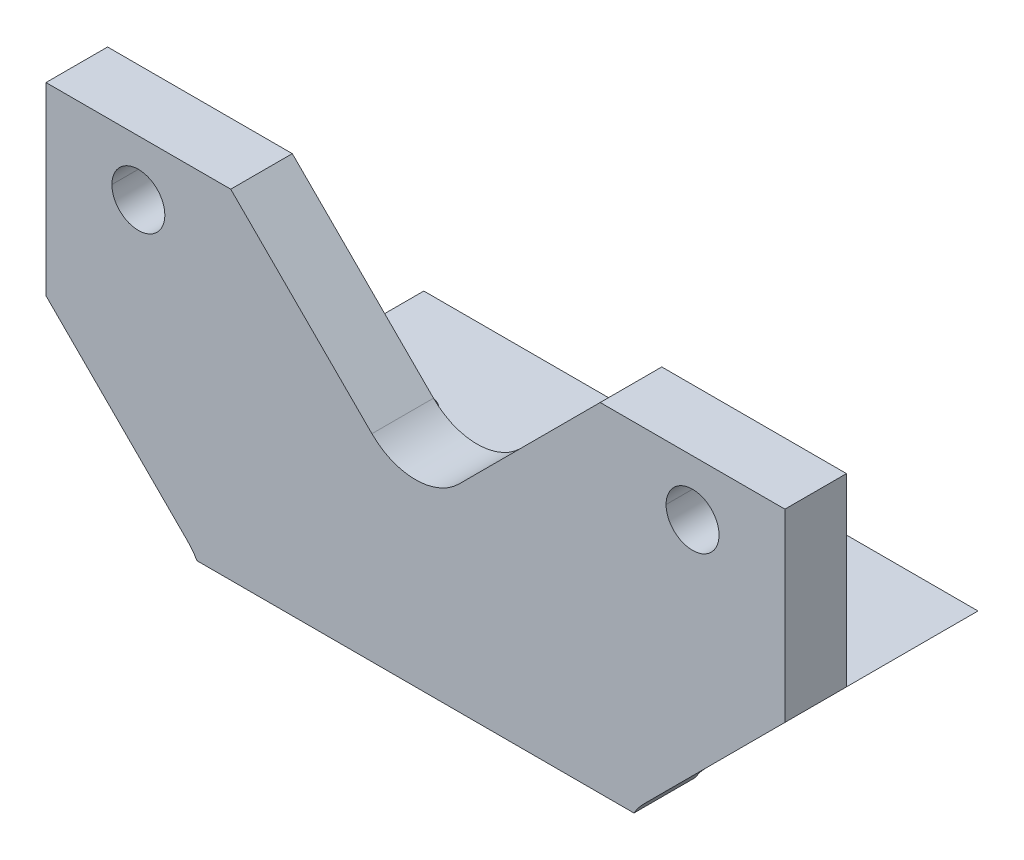
ISO-10303-21;
HEADER;
FILE_DESCRIPTION(('STEP AP214'),'2;1');
FILE_NAME('part.step','',(''),(''),'','','');
FILE_SCHEMA(('AUTOMOTIVE_DESIGN { 1 0 10303 214 1 1 1 1 }'));
ENDSEC;
DATA;
#1=APPLICATION_CONTEXT('core data for automotive mechanical design processes');
#2=APPLICATION_PROTOCOL_DEFINITION('international standard','automotive_design',2000,#1);
#3=PRODUCT_CONTEXT('',#1,'mechanical');
#4=PRODUCT('Part','Part','',(#3));
#5=PRODUCT_RELATED_PRODUCT_CATEGORY('part','',(#4));
#6=PRODUCT_DEFINITION_FORMATION('','',#4);
#7=PRODUCT_DEFINITION_CONTEXT('part definition',#1,'design');
#8=PRODUCT_DEFINITION('design','',#6,#7);
#9=PRODUCT_DEFINITION_SHAPE('','',#8);
#10=(LENGTH_UNIT() NAMED_UNIT(*) SI_UNIT(.MILLI.,.METRE.));
#11=(NAMED_UNIT(*) PLANE_ANGLE_UNIT() SI_UNIT($,.RADIAN.));
#12=(NAMED_UNIT(*) SI_UNIT($,.STERADIAN.) SOLID_ANGLE_UNIT());
#13=UNCERTAINTY_MEASURE_WITH_UNIT(LENGTH_MEASURE(1.E-05),#10,'distance_accuracy_value','');
#14=(GEOMETRIC_REPRESENTATION_CONTEXT(3) GLOBAL_UNCERTAINTY_ASSIGNED_CONTEXT((#13)) GLOBAL_UNIT_ASSIGNED_CONTEXT((#10,
#11,#12)) REPRESENTATION_CONTEXT('',''));
#15=CARTESIAN_POINT('',(0.,0.,0.));
#16=DIRECTION('',(0.,0.,1.));
#17=DIRECTION('',(1.,0.,0.));
#18=AXIS2_PLACEMENT_3D('',#15,#16,#17);
#19=CARTESIAN_POINT('',(0.,5.,0.));
#20=DIRECTION('',(0.,-1.,0.));
#21=DIRECTION('',(0.,0.,-1.));
#22=AXIS2_PLACEMENT_3D('',#19,#20,#21);
#23=PLANE('',#22);
#24=DIRECTION('',(1.,0.,0.));
#25=VECTOR('',#24,1.);
#26=CARTESIAN_POINT('',(30.,5.,35.17796271429));
#27=LINE('',#26,#25);
#28=CARTESIAN_POINT('',(-17.7409407929478,5.,35.17796271429));
#29=VERTEX_POINT('',#28);
#30=CARTESIAN_POINT('',(17.7409407929478,5.,35.17796271429));
#31=VERTEX_POINT('',#30);
#32=EDGE_CURVE('E228',#29,#31,#27,.T.);
#33=ORIENTED_EDGE('',*,*,#32,.F.);
#34=DIRECTION('',(0.,0.,-1.));
#35=VECTOR('',#34,1.);
#36=CARTESIAN_POINT('',(-17.74094079294,5.,30.17796271429));
#37=LINE('',#36,#35);
#38=CARTESIAN_POINT('',(-17.74094079294,5.,12.));
#39=VERTEX_POINT('',#38);
#40=EDGE_CURVE('E222',#29,#39,#37,.T.);
#41=ORIENTED_EDGE('',*,*,#40,.T.);
#42=DIRECTION('',(1.,0.,0.));
#43=VECTOR('',#42,1.);
#44=CARTESIAN_POINT('',(-17.74094079294,5.,12.));
#45=LINE('',#44,#43);
#46=CARTESIAN_POINT('',(17.5,5.,12.));
#47=VERTEX_POINT('',#46);
#48=EDGE_CURVE('E221',#39,#47,#45,.T.);
#49=ORIENTED_EDGE('',*,*,#48,.T.);
#50=DIRECTION('',(0.,0.,1.));
#51=VECTOR('',#50,1.);
#52=CARTESIAN_POINT('',(17.5,5.,12.));
#53=LINE('',#52,#51);
#54=CARTESIAN_POINT('',(17.5,5.,30.17796271429));
#55=VERTEX_POINT('',#54);
#56=EDGE_CURVE('E202',#47,#55,#53,.T.);
#57=ORIENTED_EDGE('',*,*,#56,.T.);
#58=DIRECTION('',(-1.,0.,0.));
#59=VECTOR('',#58,1.);
#60=CARTESIAN_POINT('',(30.,5.,30.17796271429));
#61=LINE('',#60,#59);
#62=CARTESIAN_POINT('',(17.7409407929478,5.,30.17796271429));
#63=VERTEX_POINT('',#62);
#64=EDGE_CURVE('E218',#63,#55,#61,.T.);
#65=ORIENTED_EDGE('',*,*,#64,.F.);
#66=DIRECTION('',(0.,0.,-1.));
#67=VECTOR('',#66,1.);
#68=CARTESIAN_POINT('',(17.7409407929478,5.,154.2330949086));
#69=LINE('',#68,#67);
#70=EDGE_CURVE('E233',#63,#31,#69,.F.);
#71=ORIENTED_EDGE('',*,*,#70,.T.);
#72=EDGE_LOOP('',(#33,#41,#49,#57,#65,#71));
#73=FACE_BOUND('',#72,.T.);
#74=CARTESIAN_POINT('',(-15.,5.,21.08898135714));
#75=DIRECTION('',(0.,1.,0.));
#76=DIRECTION('',(0.,0.,-1.));
#77=AXIS2_PLACEMENT_3D('',#74,#75,#76);
#78=CIRCLE('',#77,2.);
#79=CARTESIAN_POINT('',(-15.,5.,19.08898135714));
#80=VERTEX_POINT('',#79);
#81=CARTESIAN_POINT('',(-15.,5.,23.08898135714));
#82=VERTEX_POINT('',#81);
#83=EDGE_CURVE('E307',#80,#82,#78,.T.);
#84=ORIENTED_EDGE('',*,*,#83,.T.);
#85=CARTESIAN_POINT('',(-15.,5.,21.08898135714));
#86=DIRECTION('',(0.,1.,0.));
#87=DIRECTION('',(0.,0.,1.));
#88=AXIS2_PLACEMENT_3D('',#85,#86,#87);
#89=CIRCLE('',#88,2.);
#90=EDGE_CURVE('E308',#82,#80,#89,.T.);
#91=ORIENTED_EDGE('',*,*,#90,.T.);
#92=EDGE_LOOP('',(#84,#91));
#93=FACE_BOUND('',#92,.T.);
#94=CARTESIAN_POINT('',(15.,5.,21.08898135714));
#95=DIRECTION('',(0.,1.,0.));
#96=DIRECTION('',(0.,0.,-1.));
#97=AXIS2_PLACEMENT_3D('',#94,#95,#96);
#98=CIRCLE('',#97,2.);
#99=CARTESIAN_POINT('',(15.,5.,19.08898135714));
#100=VERTEX_POINT('',#99);
#101=CARTESIAN_POINT('',(15.,5.,23.08898135714));
#102=VERTEX_POINT('',#101);
#103=EDGE_CURVE('E310',#100,#102,#98,.T.);
#104=ORIENTED_EDGE('',*,*,#103,.T.);
#105=CARTESIAN_POINT('',(15.,5.,21.08898135714));
#106=DIRECTION('',(0.,1.,0.));
#107=DIRECTION('',(0.,0.,1.));
#108=AXIS2_PLACEMENT_3D('',#105,#106,#107);
#109=CIRCLE('',#108,2.);
#110=EDGE_CURVE('E334',#102,#100,#109,.T.);
#111=ORIENTED_EDGE('',*,*,#110,.T.);
#112=EDGE_LOOP('',(#104,#111));
#113=FACE_BOUND('',#112,.T.);
#114=ADVANCED_FACE('F40',(#73,#93,#113),#23,.T.);
#115=CARTESIAN_POINT('',(22.07106781187,2.5,154.2330949086));
#116=DIRECTION('',(0.,0.,-1.));
#117=DIRECTION('',(-0.707106781186548,-0.707106781186548,0.));
#118=AXIS2_PLACEMENT_3D('',#115,#116,#117);
#119=CYLINDRICAL_SURFACE('',#118,5.);
#120=ORIENTED_EDGE('',*,*,#70,.F.);
#121=CARTESIAN_POINT('',(22.07106781187,2.5,30.17796271429));
#122=DIRECTION('',(0.,0.,1.));
#123=DIRECTION('',(-0.707106781186498,0.707106781186598,0.));
#124=AXIS2_PLACEMENT_3D('',#121,#122,#123);
#125=CIRCLE('',#124,5.);
#126=CARTESIAN_POINT('',(18.53553390593,6.035533905933,30.17796271429));
#127=VERTEX_POINT('',#126);
#128=EDGE_CURVE('E226',#127,#63,#125,.T.);
#129=ORIENTED_EDGE('',*,*,#128,.F.);
#130=DIRECTION('',(0.,0.,-1.));
#131=VECTOR('',#130,1.);
#132=CARTESIAN_POINT('',(18.53553390593,6.035533905933,35.17796271429));
#133=LINE('',#132,#131);
#134=CARTESIAN_POINT('',(18.53553390593,6.035533905933,35.17796271429));
#135=VERTEX_POINT('',#134);
#136=EDGE_CURVE('E206',#135,#127,#133,.T.);
#137=ORIENTED_EDGE('',*,*,#136,.F.);
#138=CARTESIAN_POINT('',(22.07106781187,2.5,35.17796271429));
#139=DIRECTION('',(0.,0.,-1.));
#140=DIRECTION('',(-0.707106781186548,-0.707106781186548,0.));
#141=AXIS2_PLACEMENT_3D('',#138,#139,#140);
#142=CIRCLE('',#141,5.);
#143=EDGE_CURVE('E243',#31,#135,#142,.T.);
#144=ORIENTED_EDGE('',*,*,#143,.F.);
#145=EDGE_LOOP('',(#120,#129,#137,#144));
#146=FACE_BOUND('',#145,.T.);
#147=ADVANCED_FACE('F426',(#146),#119,.F.);
#148=CARTESIAN_POINT('',(30.,-27.5,35.17796271429));
#149=DIRECTION('',(0.,0.,1.));
#150=DIRECTION('',(1.,0.,0.));
#151=AXIS2_PLACEMENT_3D('',#148,#149,#150);
#152=PLANE('',#151);
#153=CARTESIAN_POINT('',(-22.5,28.,35.17796271429));
#154=DIRECTION('',(0.,0.,1.));
#155=DIRECTION('',(-1.,0.,0.));
#156=AXIS2_PLACEMENT_3D('',#153,#154,#155);
#157=CIRCLE('',#156,2.15);
#158=CARTESIAN_POINT('',(-24.65,28.,35.17796271429));
#159=VERTEX_POINT('',#158);
#160=CARTESIAN_POINT('',(-20.35,28.,35.17796271429));
#161=VERTEX_POINT('',#160);
#162=EDGE_CURVE('E333',#159,#161,#157,.T.);
#163=ORIENTED_EDGE('',*,*,#162,.F.);
#164=CARTESIAN_POINT('',(-22.5,28.,35.17796271429));
#165=DIRECTION('',(0.,0.,1.));
#166=DIRECTION('',(1.,0.,0.));
#167=AXIS2_PLACEMENT_3D('',#164,#165,#166);
#168=CIRCLE('',#167,2.15);
#169=EDGE_CURVE('E290',#161,#159,#168,.T.);
#170=ORIENTED_EDGE('',*,*,#169,.F.);
#171=EDGE_LOOP('',(#163,#170));
#172=FACE_BOUND('',#171,.T.);
#173=CARTESIAN_POINT('',(22.5,28.,35.17796271429));
#174=DIRECTION('',(0.,0.,1.));
#175=DIRECTION('',(-1.,0.,0.));
#176=AXIS2_PLACEMENT_3D('',#173,#174,#175);
#177=CIRCLE('',#176,2.15);
#178=CARTESIAN_POINT('',(20.35,28.,35.17796271429));
#179=VERTEX_POINT('',#178);
#180=CARTESIAN_POINT('',(24.65,28.,35.17796271429));
#181=VERTEX_POINT('',#180);
#182=EDGE_CURVE('E357',#179,#181,#177,.T.);
#183=ORIENTED_EDGE('',*,*,#182,.F.);
#184=CARTESIAN_POINT('',(22.5,28.,35.17796271429));
#185=DIRECTION('',(0.,0.,1.));
#186=DIRECTION('',(1.,0.,0.));
#187=AXIS2_PLACEMENT_3D('',#184,#185,#186);
#188=CIRCLE('',#187,2.15);
#189=EDGE_CURVE('E340',#181,#179,#188,.T.);
#190=ORIENTED_EDGE('',*,*,#189,.F.);
#191=EDGE_LOOP('',(#183,#190));
#192=FACE_BOUND('',#191,.T.);
#193=CARTESIAN_POINT('',(-22.07106781187,2.5,35.17796271429));
#194=DIRECTION('',(0.,0.,-1.));
#195=DIRECTION('',(0.707106781186548,0.707106781186548,0.));
#196=AXIS2_PLACEMENT_3D('',#193,#194,#195);
#197=CIRCLE('',#196,5.);
#198=CARTESIAN_POINT('',(-18.53553390593,6.035533905933,35.17796271429));
#199=VERTEX_POINT('',#198);
#200=EDGE_CURVE('E240',#199,#29,#197,.T.);
#201=ORIENTED_EDGE('',*,*,#200,.T.);
#202=ORIENTED_EDGE('',*,*,#32,.T.);
#203=ORIENTED_EDGE('',*,*,#143,.T.);
#204=DIRECTION('',(-0.707106781186548,-0.707106781186548,0.));
#205=VECTOR('',#204,1.);
#206=CARTESIAN_POINT('',(30.,17.5,35.17796271429));
#207=LINE('',#206,#205);
#208=CARTESIAN_POINT('',(30.,17.5,35.17796271429));
#209=VERTEX_POINT('',#208);
#210=EDGE_CURVE('E302',#209,#135,#207,.T.);
#211=ORIENTED_EDGE('',*,*,#210,.F.);
#212=DIRECTION('',(0.,-1.,0.));
#213=VECTOR('',#212,1.);
#214=CARTESIAN_POINT('',(30.,32.5,35.17796271429));
#215=LINE('',#214,#213);
#216=CARTESIAN_POINT('',(30.,32.5,35.17796271429));
#217=VERTEX_POINT('',#216);
#218=EDGE_CURVE('E346',#217,#209,#215,.T.);
#219=ORIENTED_EDGE('',*,*,#218,.F.);
#220=DIRECTION('',(1.,0.,0.));
#221=VECTOR('',#220,1.);
#222=CARTESIAN_POINT('',(15.,32.5,35.17796271429));
#223=LINE('',#222,#221);
#224=CARTESIAN_POINT('',(15.,32.5,35.17796271429));
#225=VERTEX_POINT('',#224);
#226=EDGE_CURVE('E320',#225,#217,#223,.T.);
#227=ORIENTED_EDGE('',*,*,#226,.F.);
#228=DIRECTION('',(0.707106781186548,0.707106781186548,0.));
#229=VECTOR('',#228,1.);
#230=CARTESIAN_POINT('',(3.535533905933,21.03553390593,35.17796271429));
#231=LINE('',#230,#229);
#232=CARTESIAN_POINT('',(3.535533905933,21.03553390593,35.17796271429));
#233=VERTEX_POINT('',#232);
#234=EDGE_CURVE('E313',#233,#225,#231,.T.);
#235=ORIENTED_EDGE('',*,*,#234,.F.);
#236=CARTESIAN_POINT('',(0.,24.57106781187,35.17796271429));
#237=DIRECTION('',(0.,0.,-1.));
#238=DIRECTION('',(0.707106781186548,-0.707106781186548,0.));
#239=AXIS2_PLACEMENT_3D('',#236,#237,#238);
#240=CIRCLE('',#239,5.);
#241=CARTESIAN_POINT('',(-3.535533905933,21.03553390593,35.17796271429));
#242=VERTEX_POINT('',#241);
#243=EDGE_CURVE('E244',#233,#242,#240,.T.);
#244=ORIENTED_EDGE('',*,*,#243,.T.);
#245=DIRECTION('',(0.707106781186548,-0.707106781186548,0.));
#246=VECTOR('',#245,1.);
#247=CARTESIAN_POINT('',(-15.,32.5,35.17796271429));
#248=LINE('',#247,#246);
#249=CARTESIAN_POINT('',(-15.,32.5,35.17796271429));
#250=VERTEX_POINT('',#249);
#251=EDGE_CURVE('E286',#250,#242,#248,.T.);
#252=ORIENTED_EDGE('',*,*,#251,.F.);
#253=DIRECTION('',(1.,0.,0.));
#254=VECTOR('',#253,1.);
#255=CARTESIAN_POINT('',(-30.,32.5,35.17796271429));
#256=LINE('',#255,#254);
#257=CARTESIAN_POINT('',(-30.,32.5,35.17796271429));
#258=VERTEX_POINT('',#257);
#259=EDGE_CURVE('E293',#258,#250,#256,.T.);
#260=ORIENTED_EDGE('',*,*,#259,.F.);
#261=DIRECTION('',(0.,1.,0.));
#262=VECTOR('',#261,1.);
#263=CARTESIAN_POINT('',(-30.,17.5,35.17796271429));
#264=LINE('',#263,#262);
#265=CARTESIAN_POINT('',(-30.,17.5,35.17796271429));
#266=VERTEX_POINT('',#265);
#267=EDGE_CURVE('E318',#266,#258,#264,.T.);
#268=ORIENTED_EDGE('',*,*,#267,.F.);
#269=DIRECTION('',(-0.707106781186548,0.707106781186548,0.));
#270=VECTOR('',#269,1.);
#271=CARTESIAN_POINT('',(-18.53553390593,6.035533905933,35.17796271429));
#272=LINE('',#271,#270);
#273=EDGE_CURVE('E349',#199,#266,#272,.T.);
#274=ORIENTED_EDGE('',*,*,#273,.F.);
#275=EDGE_LOOP('',(#201,#202,#203,#211,#219,#227,#235,#244,#252,#260,#268,#274));
#276=FACE_BOUND('',#275,.T.);
#277=ADVANCED_FACE('F432',(#172,#192,#276),#152,.T.);
#278=CARTESIAN_POINT('',(-22.07106781187,2.5,154.2330949086));
#279=DIRECTION('',(0.,0.,-1.));
#280=DIRECTION('',(0.707106781186548,0.707106781186548,0.));
#281=AXIS2_PLACEMENT_3D('',#278,#279,#280);
#282=CYLINDRICAL_SURFACE('',#281,5.);
#283=ORIENTED_EDGE('',*,*,#40,.F.);
#284=ORIENTED_EDGE('',*,*,#200,.F.);
#285=DIRECTION('',(0.,0.,-1.));
#286=VECTOR('',#285,1.);
#287=CARTESIAN_POINT('',(-18.53553390593,6.035533905933,35.17796271429));
#288=LINE('',#287,#286);
#289=CARTESIAN_POINT('',(-18.53553390593,6.035533905933,12.));
#290=VERTEX_POINT('',#289);
#291=EDGE_CURVE('E277',#199,#290,#288,.T.);
#292=ORIENTED_EDGE('',*,*,#291,.T.);
#293=CARTESIAN_POINT('',(-22.07106781187,2.5,12.));
#294=DIRECTION('',(0.,0.,1.));
#295=DIRECTION('',(0.866025403784429,0.500000000000017,0.));
#296=AXIS2_PLACEMENT_3D('',#293,#294,#295);
#297=CIRCLE('',#296,5.);
#298=EDGE_CURVE('E249',#39,#290,#297,.T.);
#299=ORIENTED_EDGE('',*,*,#298,.F.);
#300=EDGE_LOOP('',(#283,#284,#292,#299));
#301=FACE_BOUND('',#300,.T.);
#302=ADVANCED_FACE('F491',(#301),#282,.F.);
#303=CARTESIAN_POINT('',(30.,5.,30.17796271429));
#304=DIRECTION('',(0.,0.,-1.));
#305=DIRECTION('',(0.,-1.,0.));
#306=AXIS2_PLACEMENT_3D('',#303,#304,#305);
#307=PLANE('',#306);
#308=ORIENTED_EDGE('',*,*,#128,.T.);
#309=ORIENTED_EDGE('',*,*,#64,.T.);
#310=DIRECTION('',(-0.707106781186498,-0.707106781186597,0.));
#311=VECTOR('',#310,1.);
#312=CARTESIAN_POINT('',(18.53553390593,6.035533905933,30.17796271429));
#313=LINE('',#312,#311);
#314=EDGE_CURVE('E198',#127,#55,#313,.T.);
#315=ORIENTED_EDGE('',*,*,#314,.F.);
#316=EDGE_LOOP('',(#308,#309,#315));
#317=FACE_BOUND('',#316,.T.);
#318=ADVANCED_FACE('F225',(#317),#307,.T.);
#319=CARTESIAN_POINT('',(30.,0.,0.));
#320=DIRECTION('',(-1.,0.,0.));
#321=DIRECTION('',(0.,0.,1.));
#322=AXIS2_PLACEMENT_3D('',#319,#320,#321);
#323=PLANE('',#322);
#324=DIRECTION('',(0.,1.,0.));
#325=VECTOR('',#324,1.);
#326=CARTESIAN_POINT('',(30.,17.5,30.17796271429));
#327=LINE('',#326,#325);
#328=CARTESIAN_POINT('',(30.,17.5,30.17796271429));
#329=VERTEX_POINT('',#328);
#330=CARTESIAN_POINT('',(30.,32.5,30.17796271429));
#331=VERTEX_POINT('',#330);
#332=EDGE_CURVE('E227',#329,#331,#327,.T.);
#333=ORIENTED_EDGE('',*,*,#332,.T.);
#334=DIRECTION('',(0.,0.,1.));
#335=VECTOR('',#334,1.);
#336=CARTESIAN_POINT('',(30.,32.5,30.17796271429));
#337=LINE('',#336,#335);
#338=EDGE_CURVE('E231',#331,#217,#337,.T.);
#339=ORIENTED_EDGE('',*,*,#338,.T.);
#340=ORIENTED_EDGE('',*,*,#218,.T.);
#341=DIRECTION('',(0.,0.,-1.));
#342=VECTOR('',#341,1.);
#343=CARTESIAN_POINT('',(30.,17.5,35.17796271429));
#344=LINE('',#343,#342);
#345=EDGE_CURVE('E212',#209,#329,#344,.T.);
#346=ORIENTED_EDGE('',*,*,#345,.T.);
#347=EDGE_LOOP('',(#333,#339,#340,#346));
#348=FACE_BOUND('',#347,.T.);
#349=ADVANCED_FACE('F382',(#348),#323,.F.);
#350=CARTESIAN_POINT('',(30.,17.5,35.17796271429));
#351=DIRECTION('',(-0.707106781186548,0.707106781186548,0.));
#352=DIRECTION('',(0.,0.,1.));
#353=AXIS2_PLACEMENT_3D('',#350,#351,#352);
#354=PLANE('',#353);
#355=ORIENTED_EDGE('',*,*,#314,.T.);
#356=ORIENTED_EDGE('',*,*,#56,.F.);
#357=DIRECTION('',(-0.707106781186548,-0.707106781186548,0.));
#358=VECTOR('',#357,1.);
#359=CARTESIAN_POINT('',(22.5,10.,12.));
#360=LINE('',#359,#358);
#361=CARTESIAN_POINT('',(22.5,10.,12.));
#362=VERTEX_POINT('',#361);
#363=EDGE_CURVE('E261',#362,#47,#360,.T.);
#364=ORIENTED_EDGE('',*,*,#363,.F.);
#365=DIRECTION('',(0.,0.,-1.));
#366=VECTOR('',#365,1.);
#367=CARTESIAN_POINT('',(22.5,10.,30.17796271429));
#368=LINE('',#367,#366);
#369=CARTESIAN_POINT('',(22.5,10.,27.17796271429));
#370=VERTEX_POINT('',#369);
#371=EDGE_CURVE('E258',#370,#362,#368,.T.);
#372=ORIENTED_EDGE('',*,*,#371,.F.);
#373=CARTESIAN_POINT('',(25.5,13.,27.17796271429));
#374=DIRECTION('',(-0.707106781186548,0.707106781186548,0.));
#375=DIRECTION('',(-0.707106781186548,-0.707106781186548,0.));
#376=AXIS2_PLACEMENT_3D('',#373,#374,#375);
#377=ELLIPSE('',#376,4.24264068711928,3.);
#378=CARTESIAN_POINT('',(25.5,13.,30.17796271429));
#379=VERTEX_POINT('',#378);
#380=EDGE_CURVE('E48',#370,#379,#377,.T.);
#381=ORIENTED_EDGE('',*,*,#380,.T.);
#382=DIRECTION('',(0.707106781186548,0.707106781186548,0.));
#383=VECTOR('',#382,1.);
#384=CARTESIAN_POINT('',(22.5,10.,30.17796271429));
#385=LINE('',#384,#383);
#386=EDGE_CURVE('E211',#379,#329,#385,.T.);
#387=ORIENTED_EDGE('',*,*,#386,.T.);
#388=ORIENTED_EDGE('',*,*,#345,.F.);
#389=ORIENTED_EDGE('',*,*,#210,.T.);
#390=ORIENTED_EDGE('',*,*,#136,.T.);
#391=EDGE_LOOP('',(#355,#356,#364,#372,#381,#387,#388,#389,#390));
#392=FACE_BOUND('',#391,.T.);
#393=ADVANCED_FACE('F200',(#392),#354,.F.);
#394=CARTESIAN_POINT('',(15.,10.,21.08898135714));
#395=DIRECTION('',(0.,1.,0.));
#396=DIRECTION('',(0.,0.,1.));
#397=AXIS2_PLACEMENT_3D('',#394,#395,#396);
#398=CYLINDRICAL_SURFACE('',#397,2.);
#399=DIRECTION('',(0.,-1.,0.));
#400=VECTOR('',#399,1.);
#401=CARTESIAN_POINT('',(15.,10.,23.08898135714));
#402=LINE('',#401,#400);
#403=CARTESIAN_POINT('',(15.,10.,23.08898135714));
#404=VERTEX_POINT('',#403);
#405=EDGE_CURVE('E264',#404,#102,#402,.T.);
#406=ORIENTED_EDGE('',*,*,#405,.F.);
#407=CARTESIAN_POINT('',(15.,10.,21.08898135714));
#408=DIRECTION('',(0.,1.,0.));
#409=DIRECTION('',(0.,0.,1.));
#410=AXIS2_PLACEMENT_3D('',#407,#408,#409);
#411=CIRCLE('',#410,2.);
#412=CARTESIAN_POINT('',(15.,10.,19.08898135714));
#413=VERTEX_POINT('',#412);
#414=EDGE_CURVE('E301',#404,#413,#411,.T.);
#415=ORIENTED_EDGE('',*,*,#414,.T.);
#416=DIRECTION('',(0.,-1.,0.));
#417=VECTOR('',#416,1.);
#418=CARTESIAN_POINT('',(15.,10.,19.08898135714));
#419=LINE('',#418,#417);
#420=EDGE_CURVE('E223',#413,#100,#419,.T.);
#421=ORIENTED_EDGE('',*,*,#420,.T.);
#422=ORIENTED_EDGE('',*,*,#110,.F.);
#423=EDGE_LOOP('',(#406,#415,#421,#422));
#424=FACE_BOUND('',#423,.T.);
#425=ADVANCED_FACE('F418',(#424),#398,.F.);
#426=CARTESIAN_POINT('',(15.,10.,21.08898135714));
#427=DIRECTION('',(0.,1.,0.));
#428=DIRECTION('',(0.,0.,1.));
#429=AXIS2_PLACEMENT_3D('',#426,#427,#428);
#430=CYLINDRICAL_SURFACE('',#429,2.);
#431=ORIENTED_EDGE('',*,*,#420,.F.);
#432=CARTESIAN_POINT('',(15.,10.,21.08898135714));
#433=DIRECTION('',(0.,1.,0.));
#434=DIRECTION('',(0.,0.,-1.));
#435=AXIS2_PLACEMENT_3D('',#432,#433,#434);
#436=CIRCLE('',#435,2.);
#437=EDGE_CURVE('E269',#413,#404,#436,.T.);
#438=ORIENTED_EDGE('',*,*,#437,.T.);
#439=ORIENTED_EDGE('',*,*,#405,.T.);
#440=ORIENTED_EDGE('',*,*,#103,.F.);
#441=EDGE_LOOP('',(#431,#438,#439,#440));
#442=FACE_BOUND('',#441,.T.);
#443=ADVANCED_FACE('F423',(#442),#430,.F.);
#444=CARTESIAN_POINT('',(30.,10.,30.17796271429));
#445=DIRECTION('',(0.,1.,0.));
#446=DIRECTION('',(1.,0.,0.));
#447=AXIS2_PLACEMENT_3D('',#444,#445,#446);
#448=PLANE('',#447);
#449=DIRECTION('',(0.,0.,-1.));
#450=VECTOR('',#449,1.);
#451=CARTESIAN_POINT('',(-22.5,10.,30.17796271429));
#452=LINE('',#451,#450);
#453=CARTESIAN_POINT('',(-22.5,10.,27.17796271429));
#454=VERTEX_POINT('',#453);
#455=CARTESIAN_POINT('',(-22.5,10.,12.));
#456=VERTEX_POINT('',#455);
#457=EDGE_CURVE('E236',#454,#456,#452,.T.);
#458=ORIENTED_EDGE('',*,*,#457,.F.);
#459=DIRECTION('',(1.,0.,0.));
#460=VECTOR('',#459,1.);
#461=CARTESIAN_POINT('',(22.5,10.,27.17796271429));
#462=LINE('',#461,#460);
#463=EDGE_CURVE('E248',#454,#370,#462,.T.);
#464=ORIENTED_EDGE('',*,*,#463,.T.);
#465=ORIENTED_EDGE('',*,*,#371,.T.);
#466=DIRECTION('',(1.,0.,0.));
#467=VECTOR('',#466,1.);
#468=CARTESIAN_POINT('',(-22.5,10.,12.));
#469=LINE('',#468,#467);
#470=EDGE_CURVE('E317',#456,#362,#469,.T.);
#471=ORIENTED_EDGE('',*,*,#470,.F.);
#472=EDGE_LOOP('',(#458,#464,#465,#471));
#473=FACE_BOUND('',#472,.T.);
#474=CARTESIAN_POINT('',(-15.,10.,21.08898135714));
#475=DIRECTION('',(0.,1.,0.));
#476=DIRECTION('',(0.,0.,-1.));
#477=AXIS2_PLACEMENT_3D('',#474,#475,#476);
#478=CIRCLE('',#477,2.);
#479=CARTESIAN_POINT('',(-15.,10.,19.08898135714));
#480=VERTEX_POINT('',#479);
#481=CARTESIAN_POINT('',(-15.,10.,23.08898135714));
#482=VERTEX_POINT('',#481);
#483=EDGE_CURVE('E299',#480,#482,#478,.T.);
#484=ORIENTED_EDGE('',*,*,#483,.F.);
#485=CARTESIAN_POINT('',(-15.,10.,21.08898135714));
#486=DIRECTION('',(0.,1.,0.));
#487=DIRECTION('',(0.,0.,1.));
#488=AXIS2_PLACEMENT_3D('',#485,#486,#487);
#489=CIRCLE('',#488,2.);
#490=EDGE_CURVE('E263',#482,#480,#489,.T.);
#491=ORIENTED_EDGE('',*,*,#490,.F.);
#492=EDGE_LOOP('',(#484,#491));
#493=FACE_BOUND('',#492,.T.);
#494=ORIENTED_EDGE('',*,*,#437,.F.);
#495=ORIENTED_EDGE('',*,*,#414,.F.);
#496=EDGE_LOOP('',(#494,#495));
#497=FACE_BOUND('',#496,.T.);
#498=ADVANCED_FACE('F255',(#473,#493,#497),#448,.T.);
#499=CARTESIAN_POINT('',(-15.,10.,21.08898135714));
#500=DIRECTION('',(0.,1.,0.));
#501=DIRECTION('',(0.,0.,1.));
#502=AXIS2_PLACEMENT_3D('',#499,#500,#501);
#503=CYLINDRICAL_SURFACE('',#502,2.);
#504=DIRECTION('',(0.,-1.,0.));
#505=VECTOR('',#504,1.);
#506=CARTESIAN_POINT('',(-15.,10.,23.08898135714));
#507=LINE('',#506,#505);
#508=EDGE_CURVE('E296',#482,#82,#507,.T.);
#509=ORIENTED_EDGE('',*,*,#508,.F.);
#510=ORIENTED_EDGE('',*,*,#490,.T.);
#511=DIRECTION('',(0.,-1.,0.));
#512=VECTOR('',#511,1.);
#513=CARTESIAN_POINT('',(-15.,10.,19.08898135714));
#514=LINE('',#513,#512);
#515=EDGE_CURVE('E267',#480,#80,#514,.T.);
#516=ORIENTED_EDGE('',*,*,#515,.T.);
#517=ORIENTED_EDGE('',*,*,#90,.F.);
#518=EDGE_LOOP('',(#509,#510,#516,#517));
#519=FACE_BOUND('',#518,.T.);
#520=ADVANCED_FACE('F465',(#519),#503,.F.);
#521=CARTESIAN_POINT('',(-15.,10.,21.08898135714));
#522=DIRECTION('',(0.,1.,0.));
#523=DIRECTION('',(0.,0.,1.));
#524=AXIS2_PLACEMENT_3D('',#521,#522,#523);
#525=CYLINDRICAL_SURFACE('',#524,2.);
#526=ORIENTED_EDGE('',*,*,#515,.F.);
#527=ORIENTED_EDGE('',*,*,#483,.T.);
#528=ORIENTED_EDGE('',*,*,#508,.T.);
#529=ORIENTED_EDGE('',*,*,#83,.F.);
#530=EDGE_LOOP('',(#526,#527,#528,#529));
#531=FACE_BOUND('',#530,.T.);
#532=ADVANCED_FACE('F461',(#531),#525,.F.);
#533=CARTESIAN_POINT('',(-22.5,28.,35.17796271429));
#534=DIRECTION('',(0.,0.,1.));
#535=DIRECTION('',(1.,0.,0.));
#536=AXIS2_PLACEMENT_3D('',#533,#534,#535);
#537=CYLINDRICAL_SURFACE('',#536,2.15);
#538=DIRECTION('',(0.,0.,-1.));
#539=VECTOR('',#538,1.);
#540=CARTESIAN_POINT('',(-24.65,28.,35.17796271429));
#541=LINE('',#540,#539);
#542=CARTESIAN_POINT('',(-24.65,28.,30.17796271429));
#543=VERTEX_POINT('',#542);
#544=EDGE_CURVE('E246',#159,#543,#541,.T.);
#545=ORIENTED_EDGE('',*,*,#544,.T.);
#546=CARTESIAN_POINT('',(-22.5,28.,30.17796271429));
#547=DIRECTION('',(0.,0.,1.));
#548=DIRECTION('',(1.,0.,0.));
#549=AXIS2_PLACEMENT_3D('',#546,#547,#548);
#550=CIRCLE('',#549,2.15);
#551=CARTESIAN_POINT('',(-20.35,28.,30.17796271429));
#552=VERTEX_POINT('',#551);
#553=EDGE_CURVE('E279',#552,#543,#550,.T.);
#554=ORIENTED_EDGE('',*,*,#553,.F.);
#555=DIRECTION('',(0.,0.,-1.));
#556=VECTOR('',#555,1.);
#557=CARTESIAN_POINT('',(-20.35,28.,35.17796271429));
#558=LINE('',#557,#556);
#559=EDGE_CURVE('E305',#161,#552,#558,.T.);
#560=ORIENTED_EDGE('',*,*,#559,.F.);
#561=ORIENTED_EDGE('',*,*,#169,.T.);
#562=EDGE_LOOP('',(#545,#554,#560,#561));
#563=FACE_BOUND('',#562,.T.);
#564=ADVANCED_FACE('F464',(#563),#537,.F.);
#565=CARTESIAN_POINT('',(-22.5,28.,35.17796271429));
#566=DIRECTION('',(0.,0.,1.));
#567=DIRECTION('',(1.,0.,0.));
#568=AXIS2_PLACEMENT_3D('',#565,#566,#567);
#569=CYLINDRICAL_SURFACE('',#568,2.15);
#570=ORIENTED_EDGE('',*,*,#559,.T.);
#571=CARTESIAN_POINT('',(-22.5,28.,30.17796271429));
#572=DIRECTION('',(0.,0.,1.));
#573=DIRECTION('',(-1.,0.,0.));
#574=AXIS2_PLACEMENT_3D('',#571,#572,#573);
#575=CIRCLE('',#574,2.15);
#576=EDGE_CURVE('E282',#543,#552,#575,.T.);
#577=ORIENTED_EDGE('',*,*,#576,.F.);
#578=ORIENTED_EDGE('',*,*,#544,.F.);
#579=ORIENTED_EDGE('',*,*,#162,.T.);
#580=EDGE_LOOP('',(#570,#577,#578,#579));
#581=FACE_BOUND('',#580,.T.);
#582=ADVANCED_FACE('F454',(#581),#569,.F.);
#583=CARTESIAN_POINT('',(30.,32.5,30.17796271429));
#584=DIRECTION('',(0.,0.,-1.));
#585=DIRECTION('',(0.,-1.,0.));
#586=AXIS2_PLACEMENT_3D('',#583,#584,#585);
#587=PLANE('',#586);
#588=ORIENTED_EDGE('',*,*,#386,.F.);
#589=DIRECTION('',(1.,0.,0.));
#590=VECTOR('',#589,1.);
#591=CARTESIAN_POINT('',(-22.5,13.,30.17796271429));
#592=LINE('',#591,#590);
#593=CARTESIAN_POINT('',(-25.5,13.,30.17796271429));
#594=VERTEX_POINT('',#593);
#595=EDGE_CURVE('E55',#379,#594,#592,.F.);
#596=ORIENTED_EDGE('',*,*,#595,.T.);
#597=DIRECTION('',(-0.707106781186548,0.707106781186548,0.));
#598=VECTOR('',#597,1.);
#599=CARTESIAN_POINT('',(-22.5,10.,30.17796271429));
#600=LINE('',#599,#598);
#601=CARTESIAN_POINT('',(-30.,17.5,30.17796271429));
#602=VERTEX_POINT('',#601);
#603=EDGE_CURVE('E325',#594,#602,#600,.T.);
#604=ORIENTED_EDGE('',*,*,#603,.T.);
#605=DIRECTION('',(0.,-1.,0.));
#606=VECTOR('',#605,1.);
#607=CARTESIAN_POINT('',(-30.,32.5,30.17796271429));
#608=LINE('',#607,#606);
#609=CARTESIAN_POINT('',(-30.,32.5,30.17796271429));
#610=VERTEX_POINT('',#609);
#611=EDGE_CURVE('E274',#610,#602,#608,.T.);
#612=ORIENTED_EDGE('',*,*,#611,.F.);
#613=DIRECTION('',(1.,0.,0.));
#614=VECTOR('',#613,1.);
#615=CARTESIAN_POINT('',(-30.,32.5,30.17796271429));
#616=LINE('',#615,#614);
#617=CARTESIAN_POINT('',(-15.,32.5,30.17796271429));
#618=VERTEX_POINT('',#617);
#619=EDGE_CURVE('E321',#610,#618,#616,.T.);
#620=ORIENTED_EDGE('',*,*,#619,.T.);
#621=DIRECTION('',(0.707106781186548,-0.707106781186548,0.));
#622=VECTOR('',#621,1.);
#623=CARTESIAN_POINT('',(-15.,32.5,30.17796271429));
#624=LINE('',#623,#622);
#625=CARTESIAN_POINT('',(-3.535533905933,21.03553390593,30.17796271429));
#626=VERTEX_POINT('',#625);
#627=EDGE_CURVE('E324',#618,#626,#624,.T.);
#628=ORIENTED_EDGE('',*,*,#627,.T.);
#629=CARTESIAN_POINT('',(0.,24.57106781187,30.17796271429));
#630=DIRECTION('',(0.,0.,1.));
#631=DIRECTION('',(-0.707106781186548,-0.707106781186548,0.));
#632=AXIS2_PLACEMENT_3D('',#629,#630,#631);
#633=CIRCLE('',#632,5.);
#634=CARTESIAN_POINT('',(3.535533905933,21.03553390593,30.17796271429));
#635=VERTEX_POINT('',#634);
#636=EDGE_CURVE('E328',#626,#635,#633,.T.);
#637=ORIENTED_EDGE('',*,*,#636,.T.);
#638=DIRECTION('',(0.707106781186548,0.707106781186548,0.));
#639=VECTOR('',#638,1.);
#640=CARTESIAN_POINT('',(3.535533905933,21.03553390593,30.17796271429));
#641=LINE('',#640,#639);
#642=CARTESIAN_POINT('',(15.,32.5,30.17796271429));
#643=VERTEX_POINT('',#642);
#644=EDGE_CURVE('E337',#635,#643,#641,.T.);
#645=ORIENTED_EDGE('',*,*,#644,.T.);
#646=DIRECTION('',(1.,0.,0.));
#647=VECTOR('',#646,1.);
#648=CARTESIAN_POINT('',(15.,32.5,30.17796271429));
#649=LINE('',#648,#647);
#650=EDGE_CURVE('E375',#643,#331,#649,.T.);
#651=ORIENTED_EDGE('',*,*,#650,.T.);
#652=ORIENTED_EDGE('',*,*,#332,.F.);
#653=EDGE_LOOP('',(#588,#596,#604,#612,#620,#628,#637,#645,#651,#652));
#654=FACE_BOUND('',#653,.T.);
#655=CARTESIAN_POINT('',(22.5,28.,30.17796271429));
#656=DIRECTION('',(0.,0.,1.));
#657=DIRECTION('',(-1.,0.,0.));
#658=AXIS2_PLACEMENT_3D('',#655,#656,#657);
#659=CIRCLE('',#658,2.15);
#660=CARTESIAN_POINT('',(20.35,28.,30.17796271429));
#661=VERTEX_POINT('',#660);
#662=CARTESIAN_POINT('',(24.65,28.,30.17796271429));
#663=VERTEX_POINT('',#662);
#664=EDGE_CURVE('E339',#661,#663,#659,.T.);
#665=ORIENTED_EDGE('',*,*,#664,.T.);
#666=CARTESIAN_POINT('',(22.5,28.,30.17796271429));
#667=DIRECTION('',(0.,0.,1.));
#668=DIRECTION('',(1.,0.,0.));
#669=AXIS2_PLACEMENT_3D('',#666,#667,#668);
#670=CIRCLE('',#669,2.15);
#671=EDGE_CURVE('E371',#663,#661,#670,.T.);
#672=ORIENTED_EDGE('',*,*,#671,.T.);
#673=EDGE_LOOP('',(#665,#672));
#674=FACE_BOUND('',#673,.T.);
#675=ORIENTED_EDGE('',*,*,#576,.T.);
#676=ORIENTED_EDGE('',*,*,#553,.T.);
#677=EDGE_LOOP('',(#675,#676));
#678=FACE_BOUND('',#677,.T.);
#679=ADVANCED_FACE('F385',(#654,#674,#678),#587,.T.);
#680=CARTESIAN_POINT('',(22.5,28.,35.17796271429));
#681=DIRECTION('',(0.,0.,1.));
#682=DIRECTION('',(1.,0.,0.));
#683=AXIS2_PLACEMENT_3D('',#680,#681,#682);
#684=CYLINDRICAL_SURFACE('',#683,2.15);
#685=DIRECTION('',(0.,0.,-1.));
#686=VECTOR('',#685,1.);
#687=CARTESIAN_POINT('',(20.35,28.,35.17796271429));
#688=LINE('',#687,#686);
#689=EDGE_CURVE('E281',#179,#661,#688,.T.);
#690=ORIENTED_EDGE('',*,*,#689,.T.);
#691=ORIENTED_EDGE('',*,*,#671,.F.);
#692=DIRECTION('',(0.,0.,-1.));
#693=VECTOR('',#692,1.);
#694=CARTESIAN_POINT('',(24.65,28.,35.17796271429));
#695=LINE('',#694,#693);
#696=EDGE_CURVE('E343',#181,#663,#695,.T.);
#697=ORIENTED_EDGE('',*,*,#696,.F.);
#698=ORIENTED_EDGE('',*,*,#189,.T.);
#699=EDGE_LOOP('',(#690,#691,#697,#698));
#700=FACE_BOUND('',#699,.T.);
#701=ADVANCED_FACE('F453',(#700),#684,.F.);
#702=CARTESIAN_POINT('',(22.5,28.,35.17796271429));
#703=DIRECTION('',(0.,0.,1.));
#704=DIRECTION('',(1.,0.,0.));
#705=AXIS2_PLACEMENT_3D('',#702,#703,#704);
#706=CYLINDRICAL_SURFACE('',#705,2.15);
#707=ORIENTED_EDGE('',*,*,#696,.T.);
#708=ORIENTED_EDGE('',*,*,#664,.F.);
#709=ORIENTED_EDGE('',*,*,#689,.F.);
#710=ORIENTED_EDGE('',*,*,#182,.T.);
#711=EDGE_LOOP('',(#707,#708,#709,#710));
#712=FACE_BOUND('',#711,.T.);
#713=ADVANCED_FACE('F471',(#712),#706,.F.);
#714=CARTESIAN_POINT('',(0.,17.5,35.17796271429));
#715=DIRECTION('',(0.707106781186548,-0.707106781186548,0.));
#716=DIRECTION('',(0.,0.,-1.));
#717=AXIS2_PLACEMENT_3D('',#714,#715,#716);
#718=PLANE('',#717);
#719=ORIENTED_EDGE('',*,*,#234,.T.);
#720=DIRECTION('',(0.,0.,-1.));
#721=VECTOR('',#720,1.);
#722=CARTESIAN_POINT('',(15.,32.5,35.17796271429));
#723=LINE('',#722,#721);
#724=EDGE_CURVE('E287',#225,#643,#723,.T.);
#725=ORIENTED_EDGE('',*,*,#724,.T.);
#726=ORIENTED_EDGE('',*,*,#644,.F.);
#727=DIRECTION('',(0.,0.,-1.));
#728=VECTOR('',#727,1.);
#729=CARTESIAN_POINT('',(3.535533905933,21.03553390593,35.17796271429));
#730=LINE('',#729,#728);
#731=EDGE_CURVE('E283',#233,#635,#730,.T.);
#732=ORIENTED_EDGE('',*,*,#731,.F.);
#733=EDGE_LOOP('',(#719,#725,#726,#732));
#734=FACE_BOUND('',#733,.T.);
#735=ADVANCED_FACE('F458',(#734),#718,.F.);
#736=CARTESIAN_POINT('',(0.,24.57106781187,154.2330949086));
#737=DIRECTION('',(0.,0.,-1.));
#738=DIRECTION('',(0.707106781186548,-0.707106781186548,0.));
#739=AXIS2_PLACEMENT_3D('',#736,#737,#738);
#740=CYLINDRICAL_SURFACE('',#739,5.);
#741=ORIENTED_EDGE('',*,*,#636,.F.);
#742=DIRECTION('',(0.,0.,-1.));
#743=VECTOR('',#742,1.);
#744=CARTESIAN_POINT('',(-3.535533905933,21.03553390593,35.17796271429));
#745=LINE('',#744,#743);
#746=EDGE_CURVE('E292',#242,#626,#745,.T.);
#747=ORIENTED_EDGE('',*,*,#746,.F.);
#748=ORIENTED_EDGE('',*,*,#243,.F.);
#749=ORIENTED_EDGE('',*,*,#731,.T.);
#750=EDGE_LOOP('',(#741,#747,#748,#749));
#751=FACE_BOUND('',#750,.T.);
#752=ADVANCED_FACE('F455',(#751),#740,.F.);
#753=CARTESIAN_POINT('',(-15.,32.5,35.17796271429));
#754=DIRECTION('',(-0.707106781186548,-0.707106781186548,0.));
#755=DIRECTION('',(-0.707106781186548,0.707106781186548,0.));
#756=AXIS2_PLACEMENT_3D('',#753,#754,#755);
#757=PLANE('',#756);
#758=ORIENTED_EDGE('',*,*,#627,.F.);
#759=DIRECTION('',(0.,0.,-1.));
#760=VECTOR('',#759,1.);
#761=CARTESIAN_POINT('',(-15.,32.5,35.17796271429));
#762=LINE('',#761,#760);
#763=EDGE_CURVE('E295',#250,#618,#762,.T.);
#764=ORIENTED_EDGE('',*,*,#763,.F.);
#765=ORIENTED_EDGE('',*,*,#251,.T.);
#766=ORIENTED_EDGE('',*,*,#746,.T.);
#767=EDGE_LOOP('',(#758,#764,#765,#766));
#768=FACE_BOUND('',#767,.T.);
#769=ADVANCED_FACE('F457',(#768),#757,.F.);
#770=CARTESIAN_POINT('',(30.,32.5,35.17796271429));
#771=DIRECTION('',(0.,1.,0.));
#772=DIRECTION('',(1.,0.,0.));
#773=AXIS2_PLACEMENT_3D('',#770,#771,#772);
#774=PLANE('',#773);
#775=ORIENTED_EDGE('',*,*,#619,.F.);
#776=DIRECTION('',(0.,0.,-1.));
#777=VECTOR('',#776,1.);
#778=CARTESIAN_POINT('',(-30.,32.5,35.17796271429));
#779=LINE('',#778,#777);
#780=EDGE_CURVE('E278',#258,#610,#779,.T.);
#781=ORIENTED_EDGE('',*,*,#780,.F.);
#782=ORIENTED_EDGE('',*,*,#259,.T.);
#783=ORIENTED_EDGE('',*,*,#763,.T.);
#784=EDGE_LOOP('',(#775,#781,#782,#783));
#785=FACE_BOUND('',#784,.T.);
#786=ADVANCED_FACE('F509',(#785),#774,.T.);
#787=CARTESIAN_POINT('',(30.,32.5,35.17796271429));
#788=DIRECTION('',(0.,1.,0.));
#789=DIRECTION('',(1.,0.,0.));
#790=AXIS2_PLACEMENT_3D('',#787,#788,#789);
#791=PLANE('',#790);
#792=ORIENTED_EDGE('',*,*,#226,.T.);
#793=ORIENTED_EDGE('',*,*,#338,.F.);
#794=ORIENTED_EDGE('',*,*,#650,.F.);
#795=ORIENTED_EDGE('',*,*,#724,.F.);
#796=EDGE_LOOP('',(#792,#793,#794,#795));
#797=FACE_BOUND('',#796,.T.);
#798=ADVANCED_FACE('F499',(#797),#791,.T.);
#799=CARTESIAN_POINT('',(-30.,0.,0.));
#800=DIRECTION('',(-1.,0.,0.));
#801=DIRECTION('',(0.,0.,1.));
#802=AXIS2_PLACEMENT_3D('',#799,#800,#801);
#803=PLANE('',#802);
#804=ORIENTED_EDGE('',*,*,#267,.T.);
#805=ORIENTED_EDGE('',*,*,#780,.T.);
#806=ORIENTED_EDGE('',*,*,#611,.T.);
#807=DIRECTION('',(0.,0.,-1.));
#808=VECTOR('',#807,1.);
#809=CARTESIAN_POINT('',(-30.,17.5,35.17796271429));
#810=LINE('',#809,#808);
#811=EDGE_CURVE('E394',#266,#602,#810,.T.);
#812=ORIENTED_EDGE('',*,*,#811,.F.);
#813=EDGE_LOOP('',(#804,#805,#806,#812));
#814=FACE_BOUND('',#813,.T.);
#815=ADVANCED_FACE('F445',(#814),#803,.T.);
#816=CARTESIAN_POINT('',(-15.,2.5,35.17796271429));
#817=DIRECTION('',(0.707106781186548,0.707106781186548,0.));
#818=DIRECTION('',(0.,0.,-1.));
#819=AXIS2_PLACEMENT_3D('',#816,#817,#818);
#820=PLANE('',#819);
#821=ORIENTED_EDGE('',*,*,#273,.T.);
#822=ORIENTED_EDGE('',*,*,#811,.T.);
#823=ORIENTED_EDGE('',*,*,#603,.F.);
#824=CARTESIAN_POINT('',(-25.5,13.,27.17796271429));
#825=DIRECTION('',(0.707106781186548,0.707106781186548,0.));
#826=DIRECTION('',(-0.707106781186548,0.707106781186548,0.));
#827=AXIS2_PLACEMENT_3D('',#824,#825,#826);
#828=ELLIPSE('',#827,4.24264068711928,3.);
#829=EDGE_CURVE('E11',#594,#454,#828,.T.);
#830=ORIENTED_EDGE('',*,*,#829,.T.);
#831=ORIENTED_EDGE('',*,*,#457,.T.);
#832=DIRECTION('',(0.707106781186498,-0.707106781186597,0.));
#833=VECTOR('',#832,1.);
#834=CARTESIAN_POINT('',(-22.5,10.,12.));
#835=LINE('',#834,#833);
#836=EDGE_CURVE('E314',#456,#290,#835,.T.);
#837=ORIENTED_EDGE('',*,*,#836,.T.);
#838=ORIENTED_EDGE('',*,*,#291,.F.);
#839=EDGE_LOOP('',(#821,#822,#823,#830,#831,#837,#838));
#840=FACE_BOUND('',#839,.T.);
#841=ADVANCED_FACE('F439',(#840),#820,.F.);
#842=CARTESIAN_POINT('',(30.,10.,12.));
#843=DIRECTION('',(0.,0.,-1.));
#844=DIRECTION('',(0.,-1.,0.));
#845=AXIS2_PLACEMENT_3D('',#842,#843,#844);
#846=PLANE('',#845);
#847=ORIENTED_EDGE('',*,*,#470,.T.);
#848=ORIENTED_EDGE('',*,*,#363,.T.);
#849=ORIENTED_EDGE('',*,*,#48,.F.);
#850=ORIENTED_EDGE('',*,*,#298,.T.);
#851=ORIENTED_EDGE('',*,*,#836,.F.);
#852=EDGE_LOOP('',(#847,#848,#849,#850,#851));
#853=FACE_BOUND('',#852,.T.);
#854=ADVANCED_FACE('F428',(#853),#846,.T.);
#855=CARTESIAN_POINT('',(30.,13.,27.17796271429));
#856=DIRECTION('',(-1.,0.,0.));
#857=DIRECTION('',(0.,0.,1.));
#858=AXIS2_PLACEMENT_3D('',#855,#856,#857);
#859=CYLINDRICAL_SURFACE('',#858,3.);
#860=ORIENTED_EDGE('',*,*,#829,.F.);
#861=ORIENTED_EDGE('',*,*,#595,.F.);
#862=ORIENTED_EDGE('',*,*,#380,.F.);
#863=ORIENTED_EDGE('',*,*,#463,.F.);
#864=EDGE_LOOP('',(#860,#861,#862,#863));
#865=FACE_BOUND('',#864,.T.);
#866=ADVANCED_FACE('F42',(#865),#859,.F.);
#867=CLOSED_SHELL('',(#114,#147,#277,#302,#318,#349,#393,#425,#443,#498,#520,#532,#564,#582,
#679,#701,#713,#735,#752,#769,#786,#798,#815,#841,#854,#866));
#868=MANIFOLD_SOLID_BREP('B2',#867);
#869=ADVANCED_BREP_SHAPE_REPRESENTATION('',(#18,#868),#14);
#870=SHAPE_DEFINITION_REPRESENTATION(#9,#869);
ENDSEC;
END-ISO-10303-21;
